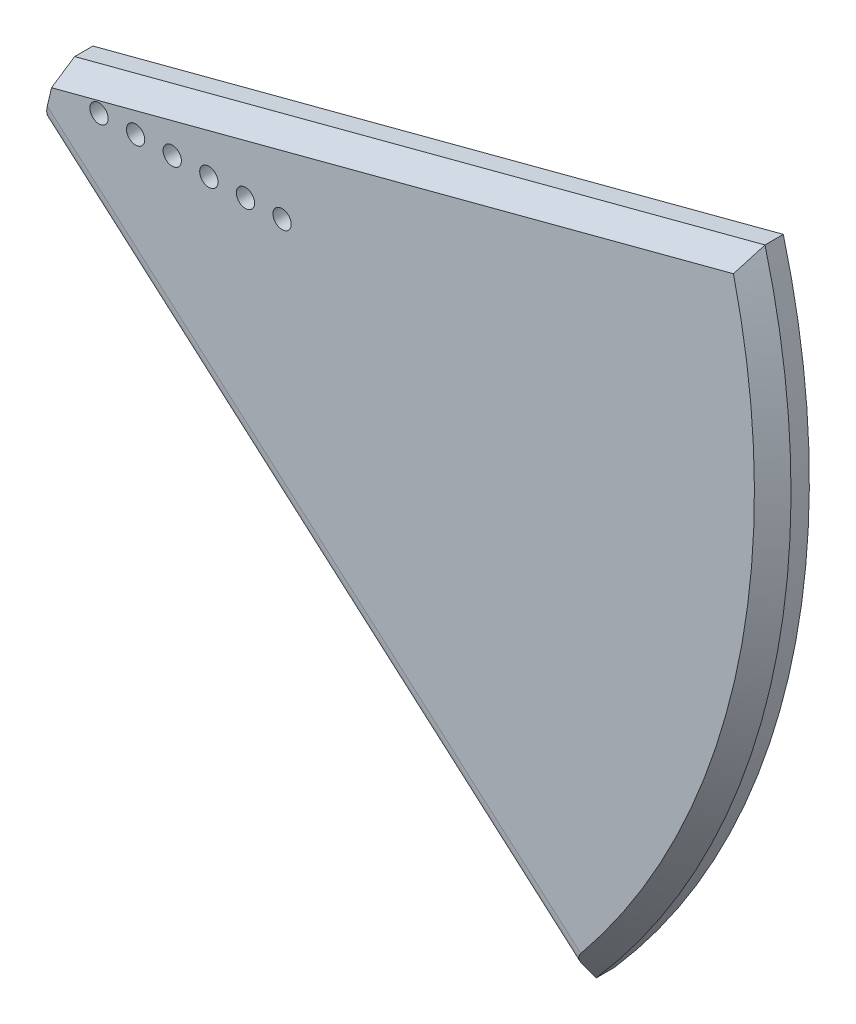
ISO-10303-21;
HEADER;
FILE_DESCRIPTION(('STEP AP214'),'2;1');
FILE_NAME('part.step','',(''),(''),'','','');
FILE_SCHEMA(('AUTOMOTIVE_DESIGN { 1 0 10303 214 1 1 1 1 }'));
ENDSEC;
DATA;
#1=APPLICATION_CONTEXT('core data for automotive mechanical design processes');
#2=APPLICATION_PROTOCOL_DEFINITION('international standard','automotive_design',2000,#1);
#3=PRODUCT_CONTEXT('',#1,'mechanical');
#4=PRODUCT('Part','Part','',(#3));
#5=PRODUCT_RELATED_PRODUCT_CATEGORY('part','',(#4));
#6=PRODUCT_DEFINITION_FORMATION('','',#4);
#7=PRODUCT_DEFINITION_CONTEXT('part definition',#1,'design');
#8=PRODUCT_DEFINITION('design','',#6,#7);
#9=PRODUCT_DEFINITION_SHAPE('','',#8);
#10=(LENGTH_UNIT() NAMED_UNIT(*) SI_UNIT(.MILLI.,.METRE.));
#11=(NAMED_UNIT(*) PLANE_ANGLE_UNIT() SI_UNIT($,.RADIAN.));
#12=(NAMED_UNIT(*) SI_UNIT($,.STERADIAN.) SOLID_ANGLE_UNIT());
#13=UNCERTAINTY_MEASURE_WITH_UNIT(LENGTH_MEASURE(1.E-05),#10,'distance_accuracy_value','');
#14=(GEOMETRIC_REPRESENTATION_CONTEXT(3) GLOBAL_UNCERTAINTY_ASSIGNED_CONTEXT((#13)) GLOBAL_UNIT_ASSIGNED_CONTEXT((#10,
#11,#12)) REPRESENTATION_CONTEXT('',''));
#15=CARTESIAN_POINT('',(0.,0.,0.));
#16=DIRECTION('',(0.,0.,1.));
#17=DIRECTION('',(1.,0.,0.));
#18=AXIS2_PLACEMENT_3D('',#15,#16,#17);
#19=CARTESIAN_POINT('',(0.,0.,2.));
#20=DIRECTION('',(0.,0.,-1.));
#21=DIRECTION('',(-1.,0.,0.));
#22=AXIS2_PLACEMENT_3D('',#19,#20,#21);
#23=PLANE('',#22);
#24=DIRECTION('',(-0.228571428571461,-0.973527144994325,0.));
#25=VECTOR('',#24,1.);
#26=CARTESIAN_POINT('',(3.00965698715945,-2.63476086574139,2.));
#27=LINE('',#26,#25);
#28=CARTESIAN_POINT('',(3.60891298247813,-0.0824209609271973,2.));
#29=VERTEX_POINT('',#28);
#30=CARTESIAN_POINT('',(3.37571502315859,-1.07565333897954,2.));
#31=VERTEX_POINT('',#30);
#32=EDGE_CURVE('E135',#29,#31,#27,.T.);
#33=ORIENTED_EDGE('',*,*,#32,.T.);
#34=DIRECTION('',(-0.752414246789862,0.658690216435348,0.));
#35=VECTOR('',#34,1.);
#36=CARTESIAN_POINT('',(32.5239684203775,-26.5930719961101,2.));
#37=LINE('',#36,#35);
#38=CARTESIAN_POINT('',(32.5150072970139,-26.5852271097153,2.));
#39=VERTEX_POINT('',#38);
#40=EDGE_CURVE('E158',#31,#39,#37,.F.);
#41=ORIENTED_EDGE('',*,*,#40,.T.);
#42=CARTESIAN_POINT('',(0.,0.,2.));
#43=DIRECTION('',(0.,0.,-1.));
#44=DIRECTION('',(-1.,0.,0.));
#45=AXIS2_PLACEMENT_3D('',#42,#43,#44);
#46=CIRCLE('',#45,42.0000000000001);
#47=CARTESIAN_POINT('',(40.8549243996259,9.74038768740022,2.));
#48=VERTEX_POINT('',#47);
#49=EDGE_CURVE('E109',#39,#48,#46,.F.);
#50=ORIENTED_EDGE('',*,*,#49,.T.);
#51=DIRECTION('',(-0.966938775510204,-0.25500863596127,0.));
#52=VECTOR('',#51,1.);
#53=CARTESIAN_POINT('',(0.255008635961266,-0.966938775510188,2.));
#54=LINE('',#53,#52);
#55=EDGE_CURVE('E141',#48,#29,#54,.T.);
#56=ORIENTED_EDGE('',*,*,#55,.T.);
#57=EDGE_LOOP('',(#33,#41,#50,#56));
#58=FACE_BOUND('',#57,.T.);
#59=CARTESIAN_POINT('',(6.19999999999976,0.,2.));
#60=DIRECTION('',(0.,0.,1.));
#61=DIRECTION('',(1.,0.,0.));
#62=AXIS2_PLACEMENT_3D('',#59,#60,#61);
#63=CIRCLE('',#62,0.499999999999994);
#64=CARTESIAN_POINT('',(6.69999999999976,0.,2.));
#65=VERTEX_POINT('',#64);
#66=EDGE_CURVE('E126',#65,#65,#63,.T.);
#67=ORIENTED_EDGE('',*,*,#66,.F.);
#68=EDGE_LOOP('',(#67));
#69=FACE_BOUND('',#68,.T.);
#70=CARTESIAN_POINT('',(8.19999999999954,0.,2.));
#71=DIRECTION('',(0.,0.,1.));
#72=DIRECTION('',(1.,0.,0.));
#73=AXIS2_PLACEMENT_3D('',#70,#71,#72);
#74=CIRCLE('',#73,0.499999999999994);
#75=CARTESIAN_POINT('',(8.69999999999953,0.,2.));
#76=VERTEX_POINT('',#75);
#77=EDGE_CURVE('E365',#76,#76,#74,.T.);
#78=ORIENTED_EDGE('',*,*,#77,.F.);
#79=EDGE_LOOP('',(#78));
#80=FACE_BOUND('',#79,.T.);
#81=CARTESIAN_POINT('',(10.1999999999993,0.,2.));
#82=DIRECTION('',(0.,0.,1.));
#83=DIRECTION('',(1.,0.,0.));
#84=AXIS2_PLACEMENT_3D('',#81,#82,#83);
#85=CIRCLE('',#84,0.499999999999994);
#86=CARTESIAN_POINT('',(10.6999999999993,0.,2.));
#87=VERTEX_POINT('',#86);
#88=EDGE_CURVE('E358',#87,#87,#85,.T.);
#89=ORIENTED_EDGE('',*,*,#88,.F.);
#90=EDGE_LOOP('',(#89));
#91=FACE_BOUND('',#90,.T.);
#92=CARTESIAN_POINT('',(12.1999999999991,0.,2.));
#93=DIRECTION('',(0.,0.,1.));
#94=DIRECTION('',(1.,0.,0.));
#95=AXIS2_PLACEMENT_3D('',#92,#93,#94);
#96=CIRCLE('',#95,0.499999999999994);
#97=CARTESIAN_POINT('',(12.6999999999991,0.,2.));
#98=VERTEX_POINT('',#97);
#99=EDGE_CURVE('E349',#98,#98,#96,.T.);
#100=ORIENTED_EDGE('',*,*,#99,.F.);
#101=EDGE_LOOP('',(#100));
#102=FACE_BOUND('',#101,.T.);
#103=CARTESIAN_POINT('',(14.2,0.,2.));
#104=DIRECTION('',(0.,0.,1.));
#105=DIRECTION('',(1.,0.,0.));
#106=AXIS2_PLACEMENT_3D('',#103,#104,#105);
#107=CIRCLE('',#106,0.499999999998905);
#108=CARTESIAN_POINT('',(14.6999999999989,0.,2.));
#109=VERTEX_POINT('',#108);
#110=EDGE_CURVE('E343',#109,#109,#107,.T.);
#111=ORIENTED_EDGE('',*,*,#110,.F.);
#112=EDGE_LOOP('',(#111));
#113=FACE_BOUND('',#112,.T.);
#114=CARTESIAN_POINT('',(16.2,0.,2.));
#115=DIRECTION('',(0.,0.,1.));
#116=DIRECTION('',(1.,0.,0.));
#117=AXIS2_PLACEMENT_3D('',#114,#115,#116);
#118=CIRCLE('',#117,0.499999999998691);
#119=CARTESIAN_POINT('',(16.6999999999987,0.,2.));
#120=VERTEX_POINT('',#119);
#121=EDGE_CURVE('E337',#120,#120,#118,.T.);
#122=ORIENTED_EDGE('',*,*,#121,.F.);
#123=EDGE_LOOP('',(#122));
#124=FACE_BOUND('',#123,.T.);
#125=ADVANCED_FACE('F41',(#58,#69,#80,#91,#102,#113,#124),#23,.F.);
#126=CARTESIAN_POINT('',(0.,0.,0.));
#127=DIRECTION('',(0.,0.,-1.));
#128=DIRECTION('',(-1.,0.,0.));
#129=AXIS2_PLACEMENT_3D('',#126,#127,#128);
#130=PLANE('',#129);
#131=CARTESIAN_POINT('',(14.2,0.,0.));
#132=DIRECTION('',(0.,0.,1.));
#133=DIRECTION('',(1.,0.,0.));
#134=AXIS2_PLACEMENT_3D('',#131,#132,#133);
#135=CIRCLE('',#134,0.499999999998905);
#136=CARTESIAN_POINT('',(14.6999999999989,0.,0.));
#137=VERTEX_POINT('',#136);
#138=EDGE_CURVE('E341',#137,#137,#135,.T.);
#139=ORIENTED_EDGE('',*,*,#138,.T.);
#140=EDGE_LOOP('',(#139));
#141=FACE_BOUND('',#140,.T.);
#142=CARTESIAN_POINT('',(10.1999999999993,0.,0.));
#143=DIRECTION('',(0.,0.,1.));
#144=DIRECTION('',(1.,0.,0.));
#145=AXIS2_PLACEMENT_3D('',#142,#143,#144);
#146=CIRCLE('',#145,0.499999999999994);
#147=CARTESIAN_POINT('',(10.6999999999993,0.,0.));
#148=VERTEX_POINT('',#147);
#149=EDGE_CURVE('E351',#148,#148,#146,.T.);
#150=ORIENTED_EDGE('',*,*,#149,.T.);
#151=EDGE_LOOP('',(#150));
#152=FACE_BOUND('',#151,.T.);
#153=CARTESIAN_POINT('',(6.19999999999976,0.,0.));
#154=DIRECTION('',(0.,0.,1.));
#155=DIRECTION('',(1.,0.,0.));
#156=AXIS2_PLACEMENT_3D('',#153,#154,#155);
#157=CIRCLE('',#156,0.499999999999994);
#158=CARTESIAN_POINT('',(6.69999999999976,0.,0.));
#159=VERTEX_POINT('',#158);
#160=EDGE_CURVE('E128',#159,#159,#157,.T.);
#161=ORIENTED_EDGE('',*,*,#160,.T.);
#162=EDGE_LOOP('',(#161));
#163=FACE_BOUND('',#162,.T.);
#164=DIRECTION('',(-0.228571428571461,-0.973527144994325,0.));
#165=VECTOR('',#164,1.);
#166=CARTESIAN_POINT('',(3.00965698715945,-2.63476086574139,0.));
#167=LINE('',#166,#165);
#168=CARTESIAN_POINT('',(3.86775510204096,1.02003454384514,0.));
#169=VERTEX_POINT('',#168);
#170=CARTESIAN_POINT('',(3.00965698715945,-2.63476086574139,0.));
#171=VERTEX_POINT('',#170);
#172=EDGE_CURVE('E117',#169,#171,#167,.T.);
#173=ORIENTED_EDGE('',*,*,#172,.F.);
#174=DIRECTION('',(-0.966938775510204,-0.25500863596127,0.));
#175=VECTOR('',#174,1.);
#176=CARTESIAN_POINT('',(3.86775510204096,1.02003454384514,0.));
#177=LINE('',#176,#175);
#178=CARTESIAN_POINT('',(41.5783673469389,10.9653713463346,0.));
#179=VERTEX_POINT('',#178);
#180=EDGE_CURVE('E138',#179,#169,#177,.T.);
#181=ORIENTED_EDGE('',*,*,#180,.F.);
#182=CARTESIAN_POINT('',(0.,0.,0.));
#183=DIRECTION('',(0.,0.,1.));
#184=DIRECTION('',(-1.,0.,0.));
#185=AXIS2_PLACEMENT_3D('',#182,#183,#184);
#186=CIRCLE('',#185,43.0000000000001);
#187=CARTESIAN_POINT('',(32.3538126119641,-28.3236793067199,0.));
#188=VERTEX_POINT('',#187);
#189=EDGE_CURVE('E119',#188,#179,#186,.T.);
#190=ORIENTED_EDGE('',*,*,#189,.F.);
#191=DIRECTION('',(0.752414246789862,-0.658690216435348,0.));
#192=VECTOR('',#191,1.);
#193=CARTESIAN_POINT('',(3.00965698715945,-2.63476086574139,0.));
#194=LINE('',#193,#192);
#195=EDGE_CURVE('E104',#171,#188,#194,.T.);
#196=ORIENTED_EDGE('',*,*,#195,.F.);
#197=EDGE_LOOP('',(#173,#181,#190,#196));
#198=FACE_BOUND('',#197,.T.);
#199=CARTESIAN_POINT('',(8.19999999999954,0.,0.));
#200=DIRECTION('',(0.,0.,1.));
#201=DIRECTION('',(1.,0.,0.));
#202=AXIS2_PLACEMENT_3D('',#199,#200,#201);
#203=CIRCLE('',#202,0.499999999999994);
#204=CARTESIAN_POINT('',(8.69999999999953,0.,0.));
#205=VERTEX_POINT('',#204);
#206=EDGE_CURVE('E360',#205,#205,#203,.T.);
#207=ORIENTED_EDGE('',*,*,#206,.T.);
#208=EDGE_LOOP('',(#207));
#209=FACE_BOUND('',#208,.T.);
#210=CARTESIAN_POINT('',(12.1999999999991,0.,0.));
#211=DIRECTION('',(0.,0.,1.));
#212=DIRECTION('',(1.,0.,0.));
#213=AXIS2_PLACEMENT_3D('',#210,#211,#212);
#214=CIRCLE('',#213,0.499999999999994);
#215=CARTESIAN_POINT('',(12.6999999999991,0.,0.));
#216=VERTEX_POINT('',#215);
#217=EDGE_CURVE('E350',#216,#216,#214,.T.);
#218=ORIENTED_EDGE('',*,*,#217,.T.);
#219=EDGE_LOOP('',(#218));
#220=FACE_BOUND('',#219,.T.);
#221=CARTESIAN_POINT('',(16.2,0.,0.));
#222=DIRECTION('',(0.,0.,1.));
#223=DIRECTION('',(1.,0.,0.));
#224=AXIS2_PLACEMENT_3D('',#221,#222,#223);
#225=CIRCLE('',#224,0.499999999998691);
#226=CARTESIAN_POINT('',(16.6999999999987,0.,0.));
#227=VERTEX_POINT('',#226);
#228=EDGE_CURVE('E334',#227,#227,#225,.T.);
#229=ORIENTED_EDGE('',*,*,#228,.T.);
#230=EDGE_LOOP('',(#229));
#231=FACE_BOUND('',#230,.T.);
#232=ADVANCED_FACE('F114',(#141,#152,#163,#198,#209,#220,#231),#130,.T.);
#233=CARTESIAN_POINT('',(3.00965698715945,-2.63476086574139,2.));
#234=DIRECTION('',(0.973527144994325,-0.228571428571461,0.));
#235=DIRECTION('',(0.228571428571461,0.973527144994325,0.));
#236=AXIS2_PLACEMENT_3D('',#233,#234,#235);
#237=PLANE('',#236);
#238=DIRECTION('',(-0.17133195312298,-0.729733843869155,-0.661916821776735));
#239=VECTOR('',#238,1.);
#240=CARTESIAN_POINT('',(3.47754012056332,-0.64196179238188,2.80760045619355));
#241=LINE('',#240,#239);
#242=CARTESIAN_POINT('',(3.00965698715945,-2.63476086574139,1.00000000000001));
#243=VERTEX_POINT('',#242);
#244=CARTESIAN_POINT('',(3.19268600515902,-1.85520710236046,1.70710678118655));
#245=VERTEX_POINT('',#244);
#246=EDGE_CURVE('E146',#243,#245,#241,.F.);
#247=ORIENTED_EDGE('',*,*,#246,.T.);
#248=CARTESIAN_POINT('',(3.37571502315859,-1.07565333897954,1.));
#249=DIRECTION('',(0.973527144994325,-0.228571428571461,0.));
#250=DIRECTION('',(-0.228571428571461,-0.973527144994325,0.));
#251=AXIS2_PLACEMENT_3D('',#248,#249,#250);
#252=ELLIPSE('',#251,1.13243427308719,1.);
#253=EDGE_CURVE('E11',#245,#31,#252,.F.);
#254=ORIENTED_EDGE('',*,*,#253,.T.);
#255=ORIENTED_EDGE('',*,*,#32,.F.);
#256=DIRECTION('',(-0.171331953122982,-0.729733843869165,0.661916821776722));
#257=VECTOR('',#256,1.);
#258=CARTESIAN_POINT('',(3.39987196863705,-0.972764529514565,2.80760045619367));
#259=LINE('',#258,#257);
#260=CARTESIAN_POINT('',(3.86775510204096,1.02003454384514,1.00000000000002));
#261=VERTEX_POINT('',#260);
#262=EDGE_CURVE('E147',#29,#261,#259,.F.);
#263=ORIENTED_EDGE('',*,*,#262,.T.);
#264=DIRECTION('',(0.,0.,-1.));
#265=VECTOR('',#264,1.);
#266=CARTESIAN_POINT('',(3.86775510204096,1.02003454384514,2.));
#267=LINE('',#266,#265);
#268=EDGE_CURVE('E121',#261,#169,#267,.T.);
#269=ORIENTED_EDGE('',*,*,#268,.T.);
#270=ORIENTED_EDGE('',*,*,#172,.T.);
#271=DIRECTION('',(0.,0.,-1.));
#272=VECTOR('',#271,1.);
#273=CARTESIAN_POINT('',(3.00965698715945,-2.63476086574139,2.));
#274=LINE('',#273,#272);
#275=EDGE_CURVE('E99',#243,#171,#274,.T.);
#276=ORIENTED_EDGE('',*,*,#275,.F.);
#277=EDGE_LOOP('',(#247,#254,#255,#263,#269,#270,#276));
#278=FACE_BOUND('',#277,.T.);
#279=ADVANCED_FACE('F125',(#278),#237,.F.);
#280=CARTESIAN_POINT('',(3.00965698715945,-2.63476086574139,2.));
#281=DIRECTION('',(0.658690216435347,0.752414246789862,0.));
#282=DIRECTION('',(-0.752414246789862,0.658690216435348,0.));
#283=AXIS2_PLACEMENT_3D('',#280,#281,#282);
#284=PLANE('',#283);
#285=DIRECTION('',(0.,0.,-1.));
#286=VECTOR('',#285,1.);
#287=CARTESIAN_POINT('',(32.3538126119641,-28.3236793067199,2.));
#288=LINE('',#287,#286);
#289=CARTESIAN_POINT('',(32.3538126119641,-28.3236793067199,1.00000000000001));
#290=VERTEX_POINT('',#289);
#291=EDGE_CURVE('E111',#290,#188,#288,.T.);
#292=ORIENTED_EDGE('',*,*,#291,.F.);
#293=DIRECTION('',(-0.752414246789862,0.658690216435348,0.));
#294=VECTOR('',#293,1.);
#295=CARTESIAN_POINT('',(3.00965698715945,-2.63476086574139,1.00000000000001));
#296=LINE('',#295,#294);
#297=EDGE_CURVE('E110',#290,#243,#296,.T.);
#298=ORIENTED_EDGE('',*,*,#297,.T.);
#299=ORIENTED_EDGE('',*,*,#275,.T.);
#300=ORIENTED_EDGE('',*,*,#195,.T.);
#301=EDGE_LOOP('',(#292,#298,#299,#300));
#302=FACE_BOUND('',#301,.T.);
#303=ADVANCED_FACE('F101',(#302),#284,.F.);
#304=CARTESIAN_POINT('',(0.,0.,2.));
#305=DIRECTION('',(0.,0.,-1.));
#306=DIRECTION('',(-1.,0.,0.));
#307=AXIS2_PLACEMENT_3D('',#304,#305,#306);
#308=CYLINDRICAL_SURFACE('',#307,43.0000000000001);
#309=DIRECTION('',(0.,0.,-1.));
#310=VECTOR('',#309,1.);
#311=CARTESIAN_POINT('',(41.5783673469389,10.9653713463346,2.));
#312=LINE('',#311,#310);
#313=CARTESIAN_POINT('',(41.5783673469389,10.9653713463346,1.00000000000001));
#314=VERTEX_POINT('',#313);
#315=EDGE_CURVE('E139',#314,#179,#312,.T.);
#316=ORIENTED_EDGE('',*,*,#315,.F.);
#317=CARTESIAN_POINT('',(0.,0.,1.00000000000001));
#318=DIRECTION('',(0.,0.,-1.));
#319=DIRECTION('',(-1.,0.,0.));
#320=AXIS2_PLACEMENT_3D('',#317,#318,#319);
#321=CIRCLE('',#320,43.0000000000001);
#322=EDGE_CURVE('E151',#314,#290,#321,.T.);
#323=ORIENTED_EDGE('',*,*,#322,.T.);
#324=ORIENTED_EDGE('',*,*,#291,.T.);
#325=ORIENTED_EDGE('',*,*,#189,.T.);
#326=EDGE_LOOP('',(#316,#323,#324,#325));
#327=FACE_BOUND('',#326,.T.);
#328=ADVANCED_FACE('F214',(#327),#308,.T.);
#329=CARTESIAN_POINT('',(3.86775510204096,1.02003454384514,2.));
#330=DIRECTION('',(0.25500863596127,-0.966938775510204,0.));
#331=DIRECTION('',(0.966938775510204,0.25500863596127,0.));
#332=AXIS2_PLACEMENT_3D('',#329,#330,#331);
#333=PLANE('',#332);
#334=ORIENTED_EDGE('',*,*,#268,.F.);
#335=DIRECTION('',(0.966938775510204,0.25500863596127,0.));
#336=VECTOR('',#335,1.);
#337=CARTESIAN_POINT('',(3.86775510204096,1.02003454384514,1.00000000000002));
#338=LINE('',#337,#336);
#339=EDGE_CURVE('E149',#261,#314,#338,.T.);
#340=ORIENTED_EDGE('',*,*,#339,.T.);
#341=ORIENTED_EDGE('',*,*,#315,.T.);
#342=ORIENTED_EDGE('',*,*,#180,.T.);
#343=EDGE_LOOP('',(#334,#340,#341,#342));
#344=FACE_BOUND('',#343,.T.);
#345=ADVANCED_FACE('F215',(#344),#333,.F.);
#346=CARTESIAN_POINT('',(6.19999999999976,0.,2.));
#347=DIRECTION('',(0.,0.,-1.));
#348=DIRECTION('',(-1.,0.,0.));
#349=AXIS2_PLACEMENT_3D('',#346,#347,#348);
#350=CYLINDRICAL_SURFACE('',#349,0.499999999999994);
#351=ORIENTED_EDGE('',*,*,#66,.T.);
#352=EDGE_LOOP('',(#351));
#353=FACE_BOUND('',#352,.T.);
#354=ORIENTED_EDGE('',*,*,#160,.F.);
#355=EDGE_LOOP('',(#354));
#356=FACE_BOUND('',#355,.T.);
#357=ADVANCED_FACE('F209',(#353,#356),#350,.F.);
#358=CARTESIAN_POINT('',(8.19999999999954,0.,2.));
#359=DIRECTION('',(0.,0.,-1.));
#360=DIRECTION('',(-1.,0.,0.));
#361=AXIS2_PLACEMENT_3D('',#358,#359,#360);
#362=CYLINDRICAL_SURFACE('',#361,0.499999999999994);
#363=ORIENTED_EDGE('',*,*,#77,.T.);
#364=EDGE_LOOP('',(#363));
#365=FACE_BOUND('',#364,.T.);
#366=ORIENTED_EDGE('',*,*,#206,.F.);
#367=EDGE_LOOP('',(#366));
#368=FACE_BOUND('',#367,.T.);
#369=ADVANCED_FACE('F253',(#365,#368),#362,.F.);
#370=CARTESIAN_POINT('',(10.1999999999993,0.,2.));
#371=DIRECTION('',(0.,0.,-1.));
#372=DIRECTION('',(-1.,0.,0.));
#373=AXIS2_PLACEMENT_3D('',#370,#371,#372);
#374=CYLINDRICAL_SURFACE('',#373,0.499999999999994);
#375=ORIENTED_EDGE('',*,*,#88,.T.);
#376=EDGE_LOOP('',(#375));
#377=FACE_BOUND('',#376,.T.);
#378=ORIENTED_EDGE('',*,*,#149,.F.);
#379=EDGE_LOOP('',(#378));
#380=FACE_BOUND('',#379,.T.);
#381=ADVANCED_FACE('F262',(#377,#380),#374,.F.);
#382=CARTESIAN_POINT('',(12.1999999999991,0.,2.));
#383=DIRECTION('',(0.,0.,-1.));
#384=DIRECTION('',(-1.,0.,0.));
#385=AXIS2_PLACEMENT_3D('',#382,#383,#384);
#386=CYLINDRICAL_SURFACE('',#385,0.499999999999994);
#387=ORIENTED_EDGE('',*,*,#99,.T.);
#388=EDGE_LOOP('',(#387));
#389=FACE_BOUND('',#388,.T.);
#390=ORIENTED_EDGE('',*,*,#217,.F.);
#391=EDGE_LOOP('',(#390));
#392=FACE_BOUND('',#391,.T.);
#393=ADVANCED_FACE('F271',(#389,#392),#386,.F.);
#394=CARTESIAN_POINT('',(14.2,0.,2.));
#395=DIRECTION('',(0.,0.,-1.));
#396=DIRECTION('',(-1.,0.,0.));
#397=AXIS2_PLACEMENT_3D('',#394,#395,#396);
#398=CYLINDRICAL_SURFACE('',#397,0.499999999998905);
#399=ORIENTED_EDGE('',*,*,#110,.T.);
#400=EDGE_LOOP('',(#399));
#401=FACE_BOUND('',#400,.T.);
#402=ORIENTED_EDGE('',*,*,#138,.F.);
#403=EDGE_LOOP('',(#402));
#404=FACE_BOUND('',#403,.T.);
#405=ADVANCED_FACE('F194',(#401,#404),#398,.F.);
#406=CARTESIAN_POINT('',(16.2,0.,2.));
#407=DIRECTION('',(0.,0.,-1.));
#408=DIRECTION('',(-1.,0.,0.));
#409=AXIS2_PLACEMENT_3D('',#406,#407,#408);
#410=CYLINDRICAL_SURFACE('',#409,0.499999999998691);
#411=ORIENTED_EDGE('',*,*,#121,.T.);
#412=EDGE_LOOP('',(#411));
#413=FACE_BOUND('',#412,.T.);
#414=ORIENTED_EDGE('',*,*,#228,.F.);
#415=EDGE_LOOP('',(#414));
#416=FACE_BOUND('',#415,.T.);
#417=ADVANCED_FACE('F186',(#413,#416),#410,.F.);
#418=CARTESIAN_POINT('',(0.658690216435352,0.752414246789867,2.));
#419=DIRECTION('',(0.465764318742665,0.532037216166475,-0.707106781186554));
#420=DIRECTION('',(0.752414246789862,-0.658690216435348,0.));
#421=AXIS2_PLACEMENT_3D('',#418,#419,#420);
#422=PLANE('',#421);
#423=CARTESIAN_POINT('',(32.2511299993275,-26.9047321816532,2.));
#424=CARTESIAN_POINT('',(32.2696856245057,-27.1415925984413,1.83400525667276));
#425=CARTESIAN_POINT('',(32.2875203222129,-27.3782684116157,1.66767454386263));
#426=CARTESIAN_POINT('',(32.3217478594892,-27.851250786569,1.33434121040382));
#427=CARTESIAN_POINT('',(32.3381406993275,-28.0875573484169,1.16733858988063));
#428=CARTESIAN_POINT('',(32.3538126119641,-28.32367930672,1.00000000000005));
#429=B_SPLINE_CURVE_WITH_KNOTS('',3,(#423,#424,#425,#426,#427,#428),.UNSPECIFIED.,.F.,.F.,(4,2,
4),(0.,0.869479618548832,1.73895907471068),.UNSPECIFIED.);
#430=CARTESIAN_POINT('',(32.2830917637247,-27.3219838773266,1.70710678118655));
#431=VERTEX_POINT('',#430);
#432=EDGE_CURVE('E168',#431,#290,#429,.T.);
#433=ORIENTED_EDGE('',*,*,#432,.F.);
#434=DIRECTION('',(0.752414246789862,-0.658690216435348,0.));
#435=VECTOR('',#434,1.);
#436=CARTESIAN_POINT('',(3.07557320902959,-1.75268239159247,1.70710678118655));
#437=LINE('',#436,#435);
#438=EDGE_CURVE('E49',#431,#245,#437,.F.);
#439=ORIENTED_EDGE('',*,*,#438,.T.);
#440=ORIENTED_EDGE('',*,*,#246,.F.);
#441=ORIENTED_EDGE('',*,*,#297,.F.);
#442=EDGE_LOOP('',(#433,#439,#440,#441));
#443=FACE_BOUND('',#442,.T.);
#444=ADVANCED_FACE('F183',(#443),#422,.F.);
#445=CARTESIAN_POINT('',(0.,0.,2.));
#446=DIRECTION('',(0.,0.,-1.));
#447=DIRECTION('',(-1.,0.,0.));
#448=AXIS2_PLACEMENT_3D('',#445,#446,#447);
#449=CONICAL_SURFACE('',#448,42.0000000000001,0.785398163397455);
#450=ORIENTED_EDGE('',*,*,#49,.F.);
#451=CARTESIAN_POINT('',(32.5150072970139,-26.5852271097153,2.));
#452=CARTESIAN_POINT('',(32.5004084860911,-26.6030774600034,2.00000312641826));
#453=CARTESIAN_POINT('',(32.4864267479736,-26.6214121640453,1.99920262642555));
#454=CARTESIAN_POINT('',(32.459787304182,-26.6588671187845,1.99604226911611));
#455=CARTESIAN_POINT('',(32.4471284189934,-26.6779866481363,1.99368381492051));
#456=CARTESIAN_POINT('',(32.4115357017747,-26.7358058765879,1.98441984515459));
#457=CARTESIAN_POINT('',(32.3906131485316,-26.7754262675729,1.97532293427133));
#458=CARTESIAN_POINT('',(32.354510253635,-26.8555222903415,1.95203200425542));
#459=CARTESIAN_POINT('',(32.3393114442232,-26.8959947188282,1.9378546712443));
#460=CARTESIAN_POINT('',(32.314246249321,-26.9770977831273,1.9051930424673));
#461=CARTESIAN_POINT('',(32.3044098147297,-27.0177280562585,1.88668536441158));
#462=CARTESIAN_POINT('',(32.2887572287135,-27.1036641698075,1.84349620100568));
#463=CARTESIAN_POINT('',(32.2836774101008,-27.1488470746962,1.8183161216922));
#464=CARTESIAN_POINT('',(32.2793058902435,-27.2370614529895,1.76482621064763));
#465=CARTESIAN_POINT('',(32.2799609085715,-27.2801090015589,1.73654759411782));
#466=CARTESIAN_POINT('',(32.2830917637247,-27.3219838773266,1.70710678118655));
#467=B_SPLINE_CURVE_WITH_KNOTS('',3,(#451,#452,#453,#454,#455,#456,#457,#458,#459,#460,#461,
#462,#463,#464,#465,#466),.UNSPECIFIED.,.F.,.F.,(4,2,2,2,2,2,2,4),(0.,0.0691238206986016,
0.13818547198186,0.274560656660278,0.410491975759486,0.547174940728994,0.702602477704388,
0.856587533466309),.UNSPECIFIED.);
#468=EDGE_CURVE('E63',#39,#431,#467,.T.);
#469=ORIENTED_EDGE('',*,*,#468,.T.);
#470=ORIENTED_EDGE('',*,*,#432,.T.);
#471=ORIENTED_EDGE('',*,*,#322,.F.);
#472=CARTESIAN_POINT('',(41.5783673469389,10.9653713463346,1.00000000000001));
#473=CARTESIAN_POINT('',(41.4592490413983,10.7608963666337,1.1673385898806));
#474=CARTESIAN_POINT('',(41.3394029820495,10.5565769147234,1.3343412104038));
#475=CARTESIAN_POINT('',(41.0982553332171,10.1482490283538,1.66767454386262));
#476=CARTESIAN_POINT('',(40.9769537434615,9.94424059395264,1.83400525667276));
#477=CARTESIAN_POINT('',(40.8549243996259,9.74038768740022,2.));
#478=B_SPLINE_CURVE_WITH_KNOTS('',3,(#472,#473,#474,#475,#476,#477),.UNSPECIFIED.,.F.,.F.,(4,2,
4),(0.,0.869479456161875,1.73895907471074),.UNSPECIFIED.);
#479=EDGE_CURVE('E160',#48,#314,#478,.F.);
#480=ORIENTED_EDGE('',*,*,#479,.F.);
#481=EDGE_LOOP('',(#450,#469,#470,#471,#480));
#482=FACE_BOUND('',#481,.T.);
#483=ADVANCED_FACE('F173',(#482),#449,.T.);
#484=CARTESIAN_POINT('',(0.255008635961266,-0.966938775510188,2.));
#485=DIRECTION('',(0.180318335749344,-0.683728965155476,-0.707106781186553));
#486=DIRECTION('',(-0.966938775510204,-0.25500863596127,0.));
#487=AXIS2_PLACEMENT_3D('',#484,#485,#486);
#488=PLANE('',#487);
#489=ORIENTED_EDGE('',*,*,#479,.T.);
#490=ORIENTED_EDGE('',*,*,#339,.F.);
#491=ORIENTED_EDGE('',*,*,#262,.F.);
#492=ORIENTED_EDGE('',*,*,#55,.F.);
#493=EDGE_LOOP('',(#489,#490,#491,#492));
#494=FACE_BOUND('',#493,.T.);
#495=ADVANCED_FACE('F180',(#494),#488,.F.);
#496=CARTESIAN_POINT('',(0.931528637485339,1.06407443233296,1.));
#497=DIRECTION('',(0.752414246789862,-0.658690216435347,0.));
#498=DIRECTION('',(0.658690216435348,0.752414246789862,0.));
#499=AXIS2_PLACEMENT_3D('',#496,#497,#498);
#500=CYLINDRICAL_SURFACE('',#499,1.);
#501=ORIENTED_EDGE('',*,*,#253,.F.);
#502=ORIENTED_EDGE('',*,*,#438,.F.);
#503=ORIENTED_EDGE('',*,*,#468,.F.);
#504=ORIENTED_EDGE('',*,*,#40,.F.);
#505=EDGE_LOOP('',(#501,#502,#503,#504));
#506=FACE_BOUND('',#505,.T.);
#507=ADVANCED_FACE('F43',(#506),#500,.T.);
#508=CLOSED_SHELL('',(#125,#232,#279,#303,#328,#345,#357,#369,#381,#393,#405,#417,#444,#483,
#495,#507));
#509=MANIFOLD_SOLID_BREP('B2',#508);
#510=ADVANCED_BREP_SHAPE_REPRESENTATION('',(#18,#509),#14);
#511=SHAPE_DEFINITION_REPRESENTATION(#9,#510);
ENDSEC;
END-ISO-10303-21;
